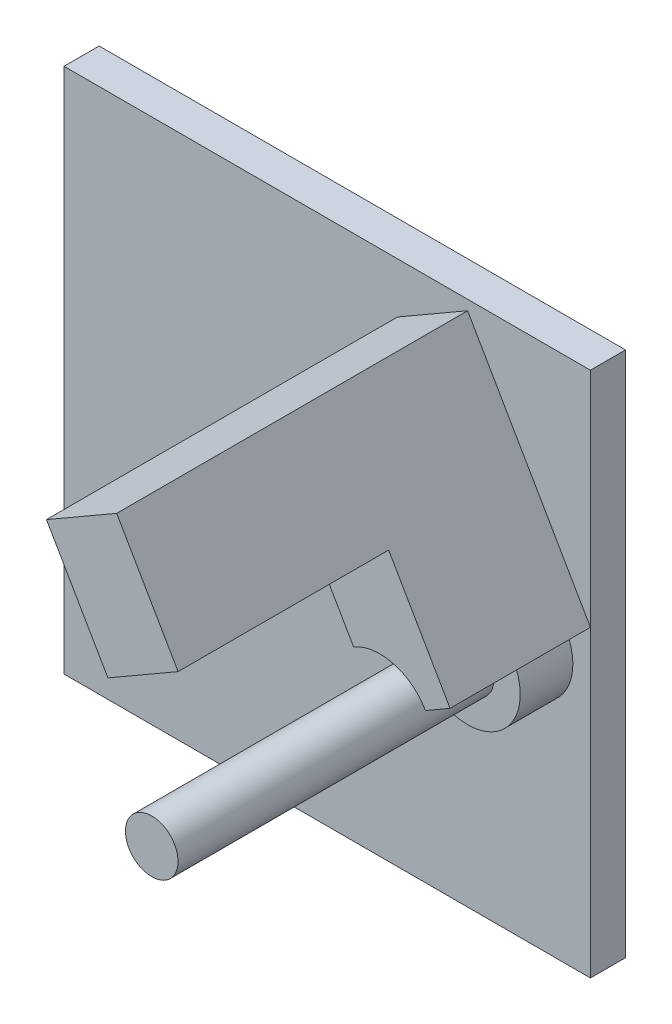
ISO-10303-21;
HEADER;
FILE_DESCRIPTION(('STEP AP214'),'2;1');
FILE_NAME('part.step','',(''),(''),'','','');
FILE_SCHEMA(('AUTOMOTIVE_DESIGN { 1 0 10303 214 1 1 1 1 }'));
ENDSEC;
DATA;
#1=APPLICATION_CONTEXT('core data for automotive mechanical design processes');
#2=APPLICATION_PROTOCOL_DEFINITION('international standard','automotive_design',2000,#1);
#3=PRODUCT_CONTEXT('',#1,'mechanical');
#4=PRODUCT('Part','Part','',(#3));
#5=PRODUCT_RELATED_PRODUCT_CATEGORY('part','',(#4));
#6=PRODUCT_DEFINITION_FORMATION('','',#4);
#7=PRODUCT_DEFINITION_CONTEXT('part definition',#1,'design');
#8=PRODUCT_DEFINITION('design','',#6,#7);
#9=PRODUCT_DEFINITION_SHAPE('','',#8);
#10=(LENGTH_UNIT() NAMED_UNIT(*) SI_UNIT(.MILLI.,.METRE.));
#11=(NAMED_UNIT(*) PLANE_ANGLE_UNIT() SI_UNIT($,.RADIAN.));
#12=(NAMED_UNIT(*) SI_UNIT($,.STERADIAN.) SOLID_ANGLE_UNIT());
#13=UNCERTAINTY_MEASURE_WITH_UNIT(LENGTH_MEASURE(1.E-05),#10,'distance_accuracy_value','');
#14=(GEOMETRIC_REPRESENTATION_CONTEXT(3) GLOBAL_UNCERTAINTY_ASSIGNED_CONTEXT((#13)) GLOBAL_UNIT_ASSIGNED_CONTEXT((#10,
#11,#12)) REPRESENTATION_CONTEXT('',''));
#15=CARTESIAN_POINT('',(0.,0.,0.));
#16=DIRECTION('',(0.,0.,1.));
#17=DIRECTION('',(1.,0.,0.));
#18=AXIS2_PLACEMENT_3D('',#15,#16,#17);
#19=CARTESIAN_POINT('',(2.75000000000001,-4.76313972081442,22.));
#20=DIRECTION('',(-0.500000000000001,0.866025403784438,0.));
#21=DIRECTION('',(-0.866025403784438,-0.500000000000001,0.));
#22=AXIS2_PLACEMENT_3D('',#19,#20,#21);
#23=PLANE('',#22);
#24=DIRECTION('',(0.866025403784438,0.500000000000001,0.));
#25=VECTOR('',#24,1.);
#26=CARTESIAN_POINT('',(15.,2.30940107675851,10.));
#27=LINE('',#26,#25);
#28=CARTESIAN_POINT('',(13.5980762113533,1.5,10.));
#29=VERTEX_POINT('',#28);
#30=CARTESIAN_POINT('',(15.,2.30940107675851,10.));
#31=VERTEX_POINT('',#30);
#32=EDGE_CURVE('E141',#29,#31,#27,.T.);
#33=ORIENTED_EDGE('',*,*,#32,.F.);
#34=DIRECTION('',(0.,0.,-1.));
#35=VECTOR('',#34,1.);
#36=CARTESIAN_POINT('',(13.5980762113533,1.5,22.));
#37=LINE('',#36,#35);
#38=CARTESIAN_POINT('',(13.5980762113533,1.5,5.));
#39=VERTEX_POINT('',#38);
#40=EDGE_CURVE('E140',#29,#39,#37,.T.);
#41=ORIENTED_EDGE('',*,*,#40,.T.);
#42=DIRECTION('',(0.,0.,-1.));
#43=VECTOR('',#42,1.);
#44=CARTESIAN_POINT('',(13.5980762113533,1.5,5.));
#45=LINE('',#44,#43);
#46=CARTESIAN_POINT('',(13.5980762113533,1.5,2.));
#47=VERTEX_POINT('',#46);
#48=EDGE_CURVE('E11',#39,#47,#45,.T.);
#49=ORIENTED_EDGE('',*,*,#48,.T.);
#50=DIRECTION('',(0.866025403784438,0.500000000000001,0.));
#51=VECTOR('',#50,1.);
#52=CARTESIAN_POINT('',(2.75000000000001,-4.76313972081442,2.));
#53=LINE('',#52,#51);
#54=CARTESIAN_POINT('',(15.,2.30940107675851,2.));
#55=VERTEX_POINT('',#54);
#56=EDGE_CURVE('E211',#47,#55,#53,.T.);
#57=ORIENTED_EDGE('',*,*,#56,.T.);
#58=DIRECTION('',(0.,0.,-1.));
#59=VECTOR('',#58,1.);
#60=CARTESIAN_POINT('',(15.,2.30940107675851,22.));
#61=LINE('',#60,#59);
#62=EDGE_CURVE('E155',#31,#55,#61,.T.);
#63=ORIENTED_EDGE('',*,*,#62,.F.);
#64=EDGE_LOOP('',(#33,#41,#49,#57,#63));
#65=FACE_BOUND('',#64,.T.);
#66=ADVANCED_FACE('F35',(#65),#23,.F.);
#67=CARTESIAN_POINT('',(11.,0.,22.));
#68=DIRECTION('',(0.,0.,-1.));
#69=DIRECTION('',(-1.,0.,0.));
#70=AXIS2_PLACEMENT_3D('',#67,#68,#69);
#71=CYLINDRICAL_SURFACE('',#70,3.);
#72=CARTESIAN_POINT('',(11.,0.,10.));
#73=DIRECTION('',(0.,0.,-1.));
#74=DIRECTION('',(1.,0.,0.));
#75=AXIS2_PLACEMENT_3D('',#72,#73,#74);
#76=CIRCLE('',#75,3.);
#77=CARTESIAN_POINT('',(9.49999999999999,2.59807621135331,10.));
#78=VERTEX_POINT('',#77);
#79=EDGE_CURVE('E128',#78,#29,#76,.T.);
#80=ORIENTED_EDGE('',*,*,#79,.F.);
#81=DIRECTION('',(0.,0.,-1.));
#82=VECTOR('',#81,1.);
#83=CARTESIAN_POINT('',(9.49999999999999,2.59807621135331,22.));
#84=LINE('',#83,#82);
#85=CARTESIAN_POINT('',(9.49999999999999,2.59807621135331,5.));
#86=VERTEX_POINT('',#85);
#87=EDGE_CURVE('E139',#78,#86,#84,.T.);
#88=ORIENTED_EDGE('',*,*,#87,.T.);
#89=CARTESIAN_POINT('',(11.,0.,5.));
#90=DIRECTION('',(0.,0.,1.));
#91=DIRECTION('',(1.,0.,0.));
#92=AXIS2_PLACEMENT_3D('',#89,#90,#91);
#93=CIRCLE('',#92,3.);
#94=EDGE_CURVE('E164',#39,#86,#93,.T.);
#95=ORIENTED_EDGE('',*,*,#94,.F.);
#96=ORIENTED_EDGE('',*,*,#40,.F.);
#97=EDGE_LOOP('',(#80,#88,#95,#96));
#98=FACE_BOUND('',#97,.T.);
#99=ADVANCED_FACE('F137',(#98),#71,.F.);
#100=CARTESIAN_POINT('',(0.,0.,2.));
#101=DIRECTION('',(0.,0.,1.));
#102=DIRECTION('',(1.,0.,0.));
#103=AXIS2_PLACEMENT_3D('',#100,#101,#102);
#104=PLANE('',#103);
#105=DIRECTION('',(0.,1.,0.));
#106=VECTOR('',#105,1.);
#107=CARTESIAN_POINT('',(15.,-15.,2.));
#108=LINE('',#107,#106);
#109=CARTESIAN_POINT('',(15.,-15.,2.));
#110=VERTEX_POINT('',#109);
#111=EDGE_CURVE('E178',#110,#55,#108,.T.);
#112=ORIENTED_EDGE('',*,*,#111,.T.);
#113=ORIENTED_EDGE('',*,*,#56,.F.);
#114=CARTESIAN_POINT('',(11.,0.,2.));
#115=DIRECTION('',(0.,0.,1.));
#116=DIRECTION('',(1.,0.,0.));
#117=AXIS2_PLACEMENT_3D('',#114,#115,#116);
#118=CIRCLE('',#117,3.);
#119=CARTESIAN_POINT('',(9.49999999999999,2.59807621135331,2.));
#120=VERTEX_POINT('',#119);
#121=EDGE_CURVE('E161',#120,#47,#118,.T.);
#122=ORIENTED_EDGE('',*,*,#121,.F.);
#123=DIRECTION('',(-0.500000000000005,0.866025403784436,0.));
#124=VECTOR('',#123,1.);
#125=CARTESIAN_POINT('',(8.24999999999995,4.76313972081444,2.));
#126=LINE('',#125,#124);
#127=CARTESIAN_POINT('',(3.99999999999995,12.1243556529821,2.));
#128=VERTEX_POINT('',#127);
#129=EDGE_CURVE('E58',#120,#128,#126,.T.);
#130=ORIENTED_EDGE('',*,*,#129,.T.);
#131=DIRECTION('',(-0.866025403784436,-0.500000000000005,0.));
#132=VECTOR('',#131,1.);
#133=CARTESIAN_POINT('',(-4.25,7.36121593216764,2.));
#134=LINE('',#133,#132);
#135=CARTESIAN_POINT('',(7.99999999999993,14.4337567297406,2.));
#136=VERTEX_POINT('',#135);
#137=EDGE_CURVE('E219',#136,#128,#134,.T.);
#138=ORIENTED_EDGE('',*,*,#137,.F.);
#139=DIRECTION('',(-0.500000000000005,0.866025403784436,0.));
#140=VECTOR('',#139,1.);
#141=CARTESIAN_POINT('',(12.2499999999999,7.07254079757297,2.));
#142=LINE('',#141,#140);
#143=EDGE_CURVE('E216',#55,#136,#142,.T.);
#144=ORIENTED_EDGE('',*,*,#143,.F.);
#145=CARTESIAN_POINT('',(15.,15.,2.));
#146=VERTEX_POINT('',#145);
#147=EDGE_CURVE('E177',#55,#146,#108,.T.);
#148=ORIENTED_EDGE('',*,*,#147,.T.);
#149=DIRECTION('',(-1.,0.,0.));
#150=VECTOR('',#149,1.);
#151=CARTESIAN_POINT('',(15.,15.,2.));
#152=LINE('',#151,#150);
#153=CARTESIAN_POINT('',(-15.,15.,2.));
#154=VERTEX_POINT('',#153);
#155=EDGE_CURVE('E181',#146,#154,#152,.T.);
#156=ORIENTED_EDGE('',*,*,#155,.T.);
#157=DIRECTION('',(0.,-1.,0.));
#158=VECTOR('',#157,1.);
#159=CARTESIAN_POINT('',(-15.,-15.,2.));
#160=LINE('',#159,#158);
#161=CARTESIAN_POINT('',(-15.,-15.,2.));
#162=VERTEX_POINT('',#161);
#163=EDGE_CURVE('E171',#154,#162,#160,.T.);
#164=ORIENTED_EDGE('',*,*,#163,.T.);
#165=DIRECTION('',(1.,0.,0.));
#166=VECTOR('',#165,1.);
#167=CARTESIAN_POINT('',(15.,-15.,2.));
#168=LINE('',#167,#166);
#169=EDGE_CURVE('E174',#162,#110,#168,.T.);
#170=ORIENTED_EDGE('',*,*,#169,.T.);
#171=EDGE_LOOP('',(#112,#113,#122,#130,#138,#144,#148,#156,#164,#170));
#172=FACE_BOUND('',#171,.T.);
#173=ADVANCED_FACE('F208',(#172),#104,.T.);
#174=CARTESIAN_POINT('',(11.,0.,5.));
#175=DIRECTION('',(0.,0.,-1.));
#176=DIRECTION('',(-1.,0.,0.));
#177=AXIS2_PLACEMENT_3D('',#174,#175,#176);
#178=CYLINDRICAL_SURFACE('',#177,3.);
#179=ORIENTED_EDGE('',*,*,#48,.F.);
#180=EDGE_CURVE('E168',#86,#39,#93,.T.);
#181=ORIENTED_EDGE('',*,*,#180,.F.);
#182=DIRECTION('',(0.,0.,-1.));
#183=VECTOR('',#182,1.);
#184=CARTESIAN_POINT('',(9.49999999999999,2.59807621135331,5.));
#185=LINE('',#184,#183);
#186=EDGE_CURVE('E43',#86,#120,#185,.T.);
#187=ORIENTED_EDGE('',*,*,#186,.T.);
#188=ORIENTED_EDGE('',*,*,#121,.T.);
#189=EDGE_LOOP('',(#179,#181,#187,#188));
#190=FACE_BOUND('',#189,.T.);
#191=ADVANCED_FACE('F204',(#190),#178,.T.);
#192=CARTESIAN_POINT('',(11.,0.,5.));
#193=DIRECTION('',(0.,0.,1.));
#194=DIRECTION('',(1.,0.,0.));
#195=AXIS2_PLACEMENT_3D('',#192,#193,#194);
#196=PLANE('',#195);
#197=ORIENTED_EDGE('',*,*,#94,.T.);
#198=ORIENTED_EDGE('',*,*,#180,.T.);
#199=EDGE_LOOP('',(#197,#198));
#200=FACE_BOUND('',#199,.T.);
#201=CARTESIAN_POINT('',(11.,0.,5.));
#202=DIRECTION('',(0.,0.,1.));
#203=DIRECTION('',(1.,0.,0.));
#204=AXIS2_PLACEMENT_3D('',#201,#202,#203);
#205=CIRCLE('',#204,1.5);
#206=CARTESIAN_POINT('',(12.5,0.,5.));
#207=VERTEX_POINT('',#206);
#208=EDGE_CURVE('E157',#207,#207,#205,.T.);
#209=ORIENTED_EDGE('',*,*,#208,.F.);
#210=EDGE_LOOP('',(#209));
#211=FACE_BOUND('',#210,.T.);
#212=ADVANCED_FACE('F260',(#200,#211),#196,.T.);
#213=CARTESIAN_POINT('',(-15.,-15.,2.));
#214=DIRECTION('',(1.,0.,0.));
#215=DIRECTION('',(0.,0.,-1.));
#216=AXIS2_PLACEMENT_3D('',#213,#214,#215);
#217=PLANE('',#216);
#218=DIRECTION('',(0.,-1.,0.));
#219=VECTOR('',#218,1.);
#220=CARTESIAN_POINT('',(-15.,-15.,0.));
#221=LINE('',#220,#219);
#222=CARTESIAN_POINT('',(-15.,15.,0.));
#223=VERTEX_POINT('',#222);
#224=CARTESIAN_POINT('',(-15.,-15.,0.));
#225=VERTEX_POINT('',#224);
#226=EDGE_CURVE('E167',#223,#225,#221,.T.);
#227=ORIENTED_EDGE('',*,*,#226,.T.);
#228=DIRECTION('',(0.,0.,-1.));
#229=VECTOR('',#228,1.);
#230=CARTESIAN_POINT('',(-15.,-15.,2.));
#231=LINE('',#230,#229);
#232=EDGE_CURVE('E199',#162,#225,#231,.T.);
#233=ORIENTED_EDGE('',*,*,#232,.F.);
#234=ORIENTED_EDGE('',*,*,#163,.F.);
#235=DIRECTION('',(0.,0.,-1.));
#236=VECTOR('',#235,1.);
#237=CARTESIAN_POINT('',(-15.,15.,2.));
#238=LINE('',#237,#236);
#239=EDGE_CURVE('E183',#154,#223,#238,.T.);
#240=ORIENTED_EDGE('',*,*,#239,.T.);
#241=EDGE_LOOP('',(#227,#233,#234,#240));
#242=FACE_BOUND('',#241,.T.);
#243=ADVANCED_FACE('F37',(#242),#217,.F.);
#244=CARTESIAN_POINT('',(15.,-15.,2.));
#245=DIRECTION('',(0.,1.,0.));
#246=DIRECTION('',(-1.,0.,0.));
#247=AXIS2_PLACEMENT_3D('',#244,#245,#246);
#248=PLANE('',#247);
#249=DIRECTION('',(1.,0.,0.));
#250=VECTOR('',#249,1.);
#251=CARTESIAN_POINT('',(15.,-15.,0.));
#252=LINE('',#251,#250);
#253=CARTESIAN_POINT('',(15.,-15.,0.));
#254=VERTEX_POINT('',#253);
#255=EDGE_CURVE('E186',#225,#254,#252,.T.);
#256=ORIENTED_EDGE('',*,*,#255,.T.);
#257=DIRECTION('',(0.,0.,-1.));
#258=VECTOR('',#257,1.);
#259=CARTESIAN_POINT('',(15.,-15.,2.));
#260=LINE('',#259,#258);
#261=EDGE_CURVE('E196',#110,#254,#260,.T.);
#262=ORIENTED_EDGE('',*,*,#261,.F.);
#263=ORIENTED_EDGE('',*,*,#169,.F.);
#264=ORIENTED_EDGE('',*,*,#232,.T.);
#265=EDGE_LOOP('',(#256,#262,#263,#264));
#266=FACE_BOUND('',#265,.T.);
#267=ADVANCED_FACE('F277',(#266),#248,.F.);
#268=CARTESIAN_POINT('',(15.,-15.,2.));
#269=DIRECTION('',(-1.,0.,0.));
#270=DIRECTION('',(0.,0.,1.));
#271=AXIS2_PLACEMENT_3D('',#268,#269,#270);
#272=PLANE('',#271);
#273=DIRECTION('',(0.,1.,0.));
#274=VECTOR('',#273,1.);
#275=CARTESIAN_POINT('',(15.,-15.,0.));
#276=LINE('',#275,#274);
#277=CARTESIAN_POINT('',(15.,15.,0.));
#278=VERTEX_POINT('',#277);
#279=EDGE_CURVE('E188',#254,#278,#276,.T.);
#280=ORIENTED_EDGE('',*,*,#279,.T.);
#281=DIRECTION('',(0.,0.,-1.));
#282=VECTOR('',#281,1.);
#283=CARTESIAN_POINT('',(15.,15.,2.));
#284=LINE('',#283,#282);
#285=EDGE_CURVE('E193',#146,#278,#284,.T.);
#286=ORIENTED_EDGE('',*,*,#285,.F.);
#287=ORIENTED_EDGE('',*,*,#147,.F.);
#288=ORIENTED_EDGE('',*,*,#111,.F.);
#289=ORIENTED_EDGE('',*,*,#261,.T.);
#290=EDGE_LOOP('',(#280,#286,#287,#288,#289));
#291=FACE_BOUND('',#290,.T.);
#292=ADVANCED_FACE('F274',(#291),#272,.F.);
#293=CARTESIAN_POINT('',(15.,15.,2.));
#294=DIRECTION('',(0.,-1.,0.));
#295=DIRECTION('',(1.,0.,0.));
#296=AXIS2_PLACEMENT_3D('',#293,#294,#295);
#297=PLANE('',#296);
#298=DIRECTION('',(-1.,0.,0.));
#299=VECTOR('',#298,1.);
#300=CARTESIAN_POINT('',(15.,15.,0.));
#301=LINE('',#300,#299);
#302=EDGE_CURVE('E175',#278,#223,#301,.T.);
#303=ORIENTED_EDGE('',*,*,#302,.T.);
#304=ORIENTED_EDGE('',*,*,#239,.F.);
#305=ORIENTED_EDGE('',*,*,#155,.F.);
#306=ORIENTED_EDGE('',*,*,#285,.T.);
#307=EDGE_LOOP('',(#303,#304,#305,#306));
#308=FACE_BOUND('',#307,.T.);
#309=ADVANCED_FACE('F270',(#308),#297,.F.);
#310=CARTESIAN_POINT('',(0.,0.,0.));
#311=DIRECTION('',(0.,0.,1.));
#312=DIRECTION('',(1.,0.,0.));
#313=AXIS2_PLACEMENT_3D('',#310,#311,#312);
#314=PLANE('',#313);
#315=ORIENTED_EDGE('',*,*,#226,.F.);
#316=ORIENTED_EDGE('',*,*,#302,.F.);
#317=ORIENTED_EDGE('',*,*,#279,.F.);
#318=ORIENTED_EDGE('',*,*,#255,.F.);
#319=EDGE_LOOP('',(#315,#316,#317,#318));
#320=FACE_BOUND('',#319,.T.);
#321=ADVANCED_FACE('F258',(#320),#314,.F.);
#322=CARTESIAN_POINT('',(11.,0.,23.));
#323=DIRECTION('',(0.,0.,-1.));
#324=DIRECTION('',(-1.,0.,0.));
#325=AXIS2_PLACEMENT_3D('',#322,#323,#324);
#326=CYLINDRICAL_SURFACE('',#325,1.5);
#327=CARTESIAN_POINT('',(11.,0.,23.));
#328=DIRECTION('',(0.,0.,1.));
#329=DIRECTION('',(1.,0.,0.));
#330=AXIS2_PLACEMENT_3D('',#327,#328,#329);
#331=CIRCLE('',#330,1.5);
#332=CARTESIAN_POINT('',(12.5,0.,23.));
#333=VERTEX_POINT('',#332);
#334=EDGE_CURVE('E158',#333,#333,#331,.T.);
#335=ORIENTED_EDGE('',*,*,#334,.F.);
#336=EDGE_LOOP('',(#335));
#337=FACE_BOUND('',#336,.T.);
#338=ORIENTED_EDGE('',*,*,#208,.T.);
#339=EDGE_LOOP('',(#338));
#340=FACE_BOUND('',#339,.T.);
#341=ADVANCED_FACE('F254',(#337,#340),#326,.T.);
#342=CARTESIAN_POINT('',(11.,0.,23.));
#343=DIRECTION('',(0.,0.,1.));
#344=DIRECTION('',(1.,0.,0.));
#345=AXIS2_PLACEMENT_3D('',#342,#343,#344);
#346=PLANE('',#345);
#347=ORIENTED_EDGE('',*,*,#334,.T.);
#348=EDGE_LOOP('',(#347));
#349=FACE_BOUND('',#348,.T.);
#350=ADVANCED_FACE('F251',(#349),#346,.T.);
#351=CARTESIAN_POINT('',(12.2499999999999,7.07254079757297,22.));
#352=DIRECTION('',(-0.866025403784436,-0.500000000000005,0.));
#353=DIRECTION('',(0.500000000000005,-0.866025403784436,0.));
#354=AXIS2_PLACEMENT_3D('',#351,#352,#353);
#355=PLANE('',#354);
#356=DIRECTION('',(-0.500000000000005,0.866025403784436,0.));
#357=VECTOR('',#356,1.);
#358=CARTESIAN_POINT('',(12.2499999999999,7.07254079757297,22.));
#359=LINE('',#358,#357);
#360=CARTESIAN_POINT('',(11.5,8.37157890324956,22.));
#361=VERTEX_POINT('',#360);
#362=CARTESIAN_POINT('',(7.99999999999993,14.4337567297406,22.));
#363=VERTEX_POINT('',#362);
#364=EDGE_CURVE('E226',#361,#363,#359,.T.);
#365=ORIENTED_EDGE('',*,*,#364,.F.);
#366=DIRECTION('',(0.,0.,1.));
#367=VECTOR('',#366,1.);
#368=CARTESIAN_POINT('',(11.5,8.37157890324958,10.));
#369=LINE('',#368,#367);
#370=CARTESIAN_POINT('',(11.5,8.37157890324958,10.));
#371=VERTEX_POINT('',#370);
#372=EDGE_CURVE('E50',#371,#361,#369,.T.);
#373=ORIENTED_EDGE('',*,*,#372,.F.);
#374=DIRECTION('',(-0.5,0.866025403784438,0.));
#375=VECTOR('',#374,1.);
#376=CARTESIAN_POINT('',(11.5,8.37157890324958,10.));
#377=LINE('',#376,#375);
#378=EDGE_CURVE('E237',#31,#371,#377,.T.);
#379=ORIENTED_EDGE('',*,*,#378,.F.);
#380=ORIENTED_EDGE('',*,*,#62,.T.);
#381=ORIENTED_EDGE('',*,*,#143,.T.);
#382=DIRECTION('',(0.,0.,-1.));
#383=VECTOR('',#382,1.);
#384=CARTESIAN_POINT('',(7.99999999999993,14.4337567297406,22.));
#385=LINE('',#384,#383);
#386=EDGE_CURVE('E147',#363,#136,#385,.T.);
#387=ORIENTED_EDGE('',*,*,#386,.F.);
#388=EDGE_LOOP('',(#365,#373,#379,#380,#381,#387));
#389=FACE_BOUND('',#388,.T.);
#390=ADVANCED_FACE('F241',(#389),#355,.F.);
#391=CARTESIAN_POINT('',(-4.25,7.36121593216764,22.));
#392=DIRECTION('',(0.500000000000005,-0.866025403784436,0.));
#393=DIRECTION('',(0.866025403784436,0.500000000000005,0.));
#394=AXIS2_PLACEMENT_3D('',#391,#392,#393);
#395=PLANE('',#394);
#396=ORIENTED_EDGE('',*,*,#137,.T.);
#397=DIRECTION('',(0.,0.,-1.));
#398=VECTOR('',#397,1.);
#399=CARTESIAN_POINT('',(3.99999999999995,12.1243556529821,22.));
#400=LINE('',#399,#398);
#401=CARTESIAN_POINT('',(3.99999999999995,12.1243556529821,22.));
#402=VERTEX_POINT('',#401);
#403=EDGE_CURVE('E145',#402,#128,#400,.T.);
#404=ORIENTED_EDGE('',*,*,#403,.F.);
#405=DIRECTION('',(-0.866025403784436,-0.500000000000005,0.));
#406=VECTOR('',#405,1.);
#407=CARTESIAN_POINT('',(-4.25,7.36121593216764,22.));
#408=LINE('',#407,#406);
#409=EDGE_CURVE('E227',#363,#402,#408,.T.);
#410=ORIENTED_EDGE('',*,*,#409,.F.);
#411=ORIENTED_EDGE('',*,*,#386,.T.);
#412=EDGE_LOOP('',(#396,#404,#410,#411));
#413=FACE_BOUND('',#412,.T.);
#414=ADVANCED_FACE('F297',(#413),#395,.F.);
#415=CARTESIAN_POINT('',(8.24999999999995,4.76313972081444,22.));
#416=DIRECTION('',(-0.866025403784436,-0.500000000000004,0.));
#417=DIRECTION('',(0.500000000000004,-0.866025403784436,0.));
#418=AXIS2_PLACEMENT_3D('',#415,#416,#417);
#419=PLANE('',#418);
#420=DIRECTION('',(0.,0.,1.));
#421=VECTOR('',#420,1.);
#422=CARTESIAN_POINT('',(7.49999999999998,6.06217782649107,10.));
#423=LINE('',#422,#421);
#424=CARTESIAN_POINT('',(7.49999999999998,6.06217782649107,10.));
#425=VERTEX_POINT('',#424);
#426=CARTESIAN_POINT('',(7.49999999999998,6.06217782649107,22.));
#427=VERTEX_POINT('',#426);
#428=EDGE_CURVE('E217',#425,#427,#423,.T.);
#429=ORIENTED_EDGE('',*,*,#428,.T.);
#430=DIRECTION('',(-0.500000000000005,0.866025403784436,0.));
#431=VECTOR('',#430,1.);
#432=CARTESIAN_POINT('',(8.24999999999995,4.76313972081444,22.));
#433=LINE('',#432,#431);
#434=EDGE_CURVE('E149',#427,#402,#433,.T.);
#435=ORIENTED_EDGE('',*,*,#434,.T.);
#436=ORIENTED_EDGE('',*,*,#403,.T.);
#437=ORIENTED_EDGE('',*,*,#129,.F.);
#438=ORIENTED_EDGE('',*,*,#186,.F.);
#439=ORIENTED_EDGE('',*,*,#87,.F.);
#440=DIRECTION('',(0.5,-0.866025403784439,0.));
#441=VECTOR('',#440,1.);
#442=CARTESIAN_POINT('',(9.49999999999999,2.59807621135331,10.));
#443=LINE('',#442,#441);
#444=EDGE_CURVE('E125',#425,#78,#443,.T.);
#445=ORIENTED_EDGE('',*,*,#444,.F.);
#446=EDGE_LOOP('',(#429,#435,#436,#437,#438,#439,#445));
#447=FACE_BOUND('',#446,.T.);
#448=ADVANCED_FACE('F143',(#447),#419,.T.);
#449=CARTESIAN_POINT('',(0.,0.,22.));
#450=DIRECTION('',(0.,0.,1.));
#451=DIRECTION('',(1.,0.,0.));
#452=AXIS2_PLACEMENT_3D('',#449,#450,#451);
#453=PLANE('',#452);
#454=DIRECTION('',(-0.866025403784438,-0.5,0.));
#455=VECTOR('',#454,1.);
#456=CARTESIAN_POINT('',(7.49999999999998,6.06217782649107,22.));
#457=LINE('',#456,#455);
#458=EDGE_CURVE('E133',#361,#427,#457,.T.);
#459=ORIENTED_EDGE('',*,*,#458,.F.);
#460=ORIENTED_EDGE('',*,*,#364,.T.);
#461=ORIENTED_EDGE('',*,*,#409,.T.);
#462=ORIENTED_EDGE('',*,*,#434,.F.);
#463=EDGE_LOOP('',(#459,#460,#461,#462));
#464=FACE_BOUND('',#463,.T.);
#465=ADVANCED_FACE('F300',(#464),#453,.T.);
#466=CARTESIAN_POINT('',(7.49999999999998,6.06217782649107,10.));
#467=DIRECTION('',(-0.5,0.866025403784438,0.));
#468=DIRECTION('',(-0.866025403784438,-0.5,0.));
#469=AXIS2_PLACEMENT_3D('',#466,#467,#468);
#470=PLANE('',#469);
#471=ORIENTED_EDGE('',*,*,#458,.T.);
#472=ORIENTED_EDGE('',*,*,#428,.F.);
#473=DIRECTION('',(-0.866025403784438,-0.5,0.));
#474=VECTOR('',#473,1.);
#475=CARTESIAN_POINT('',(7.49999999999998,6.06217782649107,10.));
#476=LINE('',#475,#474);
#477=EDGE_CURVE('E130',#371,#425,#476,.T.);
#478=ORIENTED_EDGE('',*,*,#477,.F.);
#479=ORIENTED_EDGE('',*,*,#372,.T.);
#480=EDGE_LOOP('',(#471,#472,#478,#479));
#481=FACE_BOUND('',#480,.T.);
#482=ADVANCED_FACE('F301',(#481),#470,.F.);
#483=CARTESIAN_POINT('',(11.,0.,10.));
#484=DIRECTION('',(0.,0.,1.));
#485=DIRECTION('',(1.,0.,0.));
#486=AXIS2_PLACEMENT_3D('',#483,#484,#485);
#487=PLANE('',#486);
#488=ORIENTED_EDGE('',*,*,#444,.T.);
#489=ORIENTED_EDGE('',*,*,#79,.T.);
#490=ORIENTED_EDGE('',*,*,#32,.T.);
#491=ORIENTED_EDGE('',*,*,#378,.T.);
#492=ORIENTED_EDGE('',*,*,#477,.T.);
#493=EDGE_LOOP('',(#488,#489,#490,#491,#492));
#494=FACE_BOUND('',#493,.T.);
#495=ADVANCED_FACE('F127',(#494),#487,.T.);
#496=CLOSED_SHELL('',(#66,#99,#173,#191,#212,#243,#267,#292,#309,#321,#341,#350,#390,#414,#448,
#465,#482,#495));
#497=MANIFOLD_SOLID_BREP('B2',#496);
#498=ADVANCED_BREP_SHAPE_REPRESENTATION('',(#18,#497),#14);
#499=SHAPE_DEFINITION_REPRESENTATION(#9,#498);
ENDSEC;
END-ISO-10303-21;
